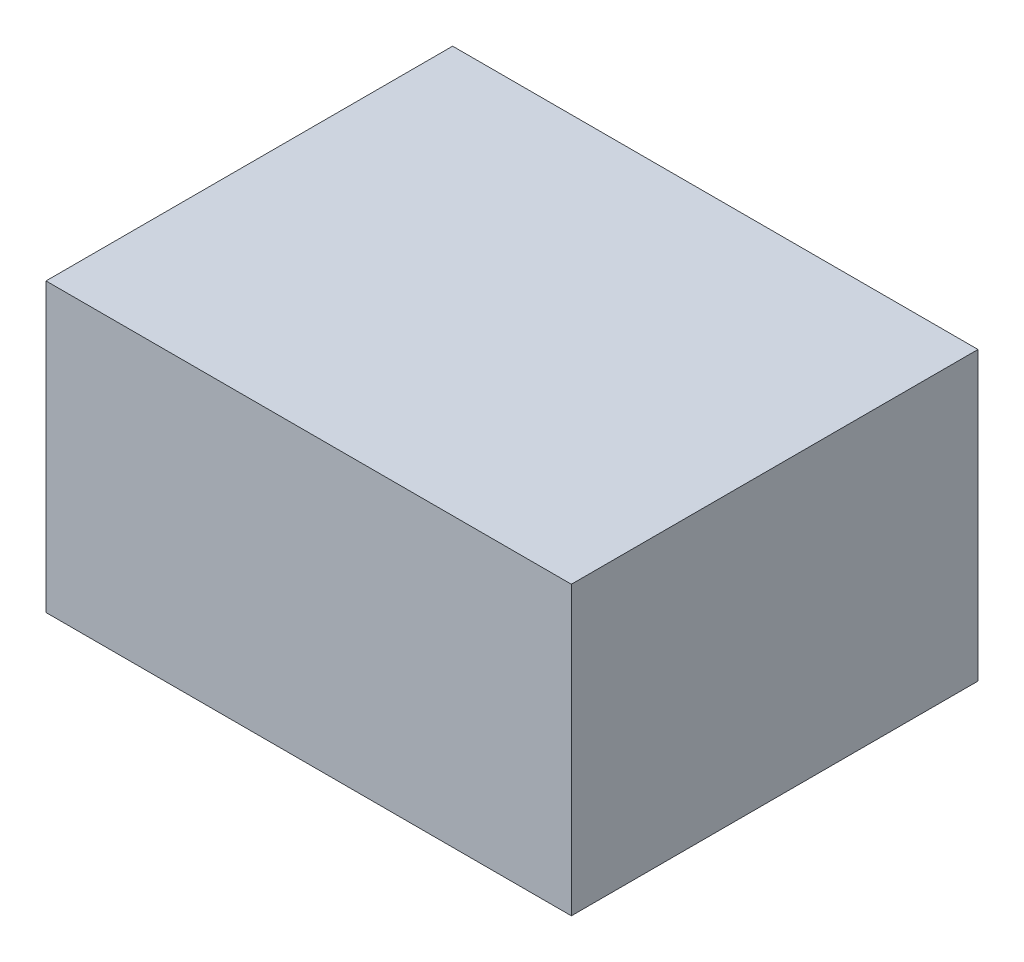
ISO-10303-21;
HEADER;
FILE_DESCRIPTION(('STEP AP214'),'2;1');
FILE_NAME('part.step','',(''),(''),'','','');
FILE_SCHEMA(('AUTOMOTIVE_DESIGN { 1 0 10303 214 1 1 1 1 }'));
ENDSEC;
DATA;
#1=APPLICATION_CONTEXT('core data for automotive mechanical design processes');
#2=APPLICATION_PROTOCOL_DEFINITION('international standard','automotive_design',2000,#1);
#3=PRODUCT_CONTEXT('',#1,'mechanical');
#4=PRODUCT('Part','Part','',(#3));
#5=PRODUCT_RELATED_PRODUCT_CATEGORY('part','',(#4));
#6=PRODUCT_DEFINITION_FORMATION('','',#4);
#7=PRODUCT_DEFINITION_CONTEXT('part definition',#1,'design');
#8=PRODUCT_DEFINITION('design','',#6,#7);
#9=PRODUCT_DEFINITION_SHAPE('','',#8);
#10=(LENGTH_UNIT() NAMED_UNIT(*) SI_UNIT(.MILLI.,.METRE.));
#11=(NAMED_UNIT(*) PLANE_ANGLE_UNIT() SI_UNIT($,.RADIAN.));
#12=(NAMED_UNIT(*) SI_UNIT($,.STERADIAN.) SOLID_ANGLE_UNIT());
#13=UNCERTAINTY_MEASURE_WITH_UNIT(LENGTH_MEASURE(1.E-05),#10,'distance_accuracy_value','');
#14=(GEOMETRIC_REPRESENTATION_CONTEXT(3) GLOBAL_UNCERTAINTY_ASSIGNED_CONTEXT((#13)) GLOBAL_UNIT_ASSIGNED_CONTEXT((#10,
#11,#12)) REPRESENTATION_CONTEXT('',''));
#15=CARTESIAN_POINT('',(0.,0.,0.));
#16=DIRECTION('',(0.,0.,1.));
#17=DIRECTION('',(1.,0.,0.));
#18=AXIS2_PLACEMENT_3D('',#15,#16,#17);
#19=CARTESIAN_POINT('',(-12.5,12.36,0.));
#20=DIRECTION('',(1.,0.,0.));
#21=DIRECTION('',(0.,0.,-1.));
#22=AXIS2_PLACEMENT_3D('',#19,#20,#21);
#23=PLANE('',#22);
#24=DIRECTION('',(0.,-1.,0.));
#25=VECTOR('',#24,1.);
#26=CARTESIAN_POINT('',(-12.5,12.36,-35.));
#27=LINE('',#26,#25);
#28=CARTESIAN_POINT('',(-12.5,12.36,-35.));
#29=VERTEX_POINT('',#28);
#30=CARTESIAN_POINT('',(-12.5,-12.36,-35.));
#31=VERTEX_POINT('',#30);
#32=EDGE_CURVE('E105',#29,#31,#27,.T.);
#33=ORIENTED_EDGE('',*,*,#32,.T.);
#34=DIRECTION('',(0.,0.,-1.));
#35=VECTOR('',#34,1.);
#36=CARTESIAN_POINT('',(-12.5,-12.36,0.));
#37=LINE('',#36,#35);
#38=CARTESIAN_POINT('',(-12.5,-12.36,0.));
#39=VERTEX_POINT('',#38);
#40=EDGE_CURVE('E11',#39,#31,#37,.T.);
#41=ORIENTED_EDGE('',*,*,#40,.F.);
#42=DIRECTION('',(0.,-1.,0.));
#43=VECTOR('',#42,1.);
#44=CARTESIAN_POINT('',(-12.5,12.36,0.));
#45=LINE('',#44,#43);
#46=CARTESIAN_POINT('',(-12.5,12.36,0.));
#47=VERTEX_POINT('',#46);
#48=EDGE_CURVE('E89',#47,#39,#45,.T.);
#49=ORIENTED_EDGE('',*,*,#48,.F.);
#50=DIRECTION('',(0.,0.,-1.));
#51=VECTOR('',#50,1.);
#52=CARTESIAN_POINT('',(-12.5,12.36,0.));
#53=LINE('',#52,#51);
#54=EDGE_CURVE('E97',#47,#29,#53,.T.);
#55=ORIENTED_EDGE('',*,*,#54,.T.);
#56=EDGE_LOOP('',(#33,#41,#49,#55));
#57=FACE_BOUND('',#56,.T.);
#58=ADVANCED_FACE('F39',(#57),#23,.F.);
#59=CARTESIAN_POINT('',(-12.5,-12.36,0.));
#60=DIRECTION('',(0.,1.,0.));
#61=DIRECTION('',(0.,0.,1.));
#62=AXIS2_PLACEMENT_3D('',#59,#60,#61);
#63=PLANE('',#62);
#64=DIRECTION('',(1.,0.,0.));
#65=VECTOR('',#64,1.);
#66=CARTESIAN_POINT('',(-12.5,-12.36,-35.));
#67=LINE('',#66,#65);
#68=CARTESIAN_POINT('',(32.72,-12.36,-35.));
#69=VERTEX_POINT('',#68);
#70=EDGE_CURVE('E92',#31,#69,#67,.T.);
#71=ORIENTED_EDGE('',*,*,#70,.T.);
#72=DIRECTION('',(0.,0.,-1.));
#73=VECTOR('',#72,1.);
#74=CARTESIAN_POINT('',(32.72,-12.36,0.));
#75=LINE('',#74,#73);
#76=CARTESIAN_POINT('',(32.72,-12.36,0.));
#77=VERTEX_POINT('',#76);
#78=EDGE_CURVE('E50',#77,#69,#75,.T.);
#79=ORIENTED_EDGE('',*,*,#78,.F.);
#80=DIRECTION('',(1.,0.,0.));
#81=VECTOR('',#80,1.);
#82=CARTESIAN_POINT('',(-12.5,-12.36,0.));
#83=LINE('',#82,#81);
#84=EDGE_CURVE('E82',#39,#77,#83,.T.);
#85=ORIENTED_EDGE('',*,*,#84,.F.);
#86=ORIENTED_EDGE('',*,*,#40,.T.);
#87=EDGE_LOOP('',(#71,#79,#85,#86));
#88=FACE_BOUND('',#87,.T.);
#89=ADVANCED_FACE('F93',(#88),#63,.F.);
#90=CARTESIAN_POINT('',(32.72,-12.36,0.));
#91=DIRECTION('',(-1.,0.,0.));
#92=DIRECTION('',(0.,0.,1.));
#93=AXIS2_PLACEMENT_3D('',#90,#91,#92);
#94=PLANE('',#93);
#95=DIRECTION('',(0.,1.,0.));
#96=VECTOR('',#95,1.);
#97=CARTESIAN_POINT('',(32.72,-12.36,-35.));
#98=LINE('',#97,#96);
#99=CARTESIAN_POINT('',(32.72,12.36,-35.));
#100=VERTEX_POINT('',#99);
#101=EDGE_CURVE('E74',#69,#100,#98,.T.);
#102=ORIENTED_EDGE('',*,*,#101,.T.);
#103=DIRECTION('',(0.,0.,-1.));
#104=VECTOR('',#103,1.);
#105=CARTESIAN_POINT('',(32.72,12.36,0.));
#106=LINE('',#105,#104);
#107=CARTESIAN_POINT('',(32.72,12.36,0.));
#108=VERTEX_POINT('',#107);
#109=EDGE_CURVE('E94',#108,#100,#106,.T.);
#110=ORIENTED_EDGE('',*,*,#109,.F.);
#111=DIRECTION('',(0.,1.,0.));
#112=VECTOR('',#111,1.);
#113=CARTESIAN_POINT('',(32.72,-12.36,0.));
#114=LINE('',#113,#112);
#115=EDGE_CURVE('E88',#77,#108,#114,.T.);
#116=ORIENTED_EDGE('',*,*,#115,.F.);
#117=ORIENTED_EDGE('',*,*,#78,.T.);
#118=EDGE_LOOP('',(#102,#110,#116,#117));
#119=FACE_BOUND('',#118,.T.);
#120=ADVANCED_FACE('F96',(#119),#94,.F.);
#121=CARTESIAN_POINT('',(32.72,12.36,0.));
#122=DIRECTION('',(0.,-1.,0.));
#123=DIRECTION('',(0.,0.,-1.));
#124=AXIS2_PLACEMENT_3D('',#121,#122,#123);
#125=PLANE('',#124);
#126=DIRECTION('',(-1.,0.,0.));
#127=VECTOR('',#126,1.);
#128=CARTESIAN_POINT('',(32.72,12.36,-35.));
#129=LINE('',#128,#127);
#130=EDGE_CURVE('E76',#100,#29,#129,.T.);
#131=ORIENTED_EDGE('',*,*,#130,.T.);
#132=ORIENTED_EDGE('',*,*,#54,.F.);
#133=DIRECTION('',(-1.,0.,0.));
#134=VECTOR('',#133,1.);
#135=CARTESIAN_POINT('',(32.72,12.36,0.));
#136=LINE('',#135,#134);
#137=EDGE_CURVE('E54',#108,#47,#136,.T.);
#138=ORIENTED_EDGE('',*,*,#137,.F.);
#139=ORIENTED_EDGE('',*,*,#109,.T.);
#140=EDGE_LOOP('',(#131,#132,#138,#139));
#141=FACE_BOUND('',#140,.T.);
#142=ADVANCED_FACE('F106',(#141),#125,.F.);
#143=CARTESIAN_POINT('',(0.,0.,0.));
#144=DIRECTION('',(0.,0.,1.));
#145=DIRECTION('',(1.,0.,0.));
#146=AXIS2_PLACEMENT_3D('',#143,#144,#145);
#147=PLANE('',#146);
#148=ORIENTED_EDGE('',*,*,#48,.T.);
#149=ORIENTED_EDGE('',*,*,#84,.T.);
#150=ORIENTED_EDGE('',*,*,#115,.T.);
#151=ORIENTED_EDGE('',*,*,#137,.T.);
#152=EDGE_LOOP('',(#148,#149,#150,#151));
#153=FACE_BOUND('',#152,.T.);
#154=ADVANCED_FACE('F86',(#153),#147,.T.);
#155=CARTESIAN_POINT('',(0.,0.,-35.));
#156=DIRECTION('',(0.,0.,1.));
#157=DIRECTION('',(1.,0.,0.));
#158=AXIS2_PLACEMENT_3D('',#155,#156,#157);
#159=PLANE('',#158);
#160=ORIENTED_EDGE('',*,*,#32,.F.);
#161=ORIENTED_EDGE('',*,*,#130,.F.);
#162=ORIENTED_EDGE('',*,*,#101,.F.);
#163=ORIENTED_EDGE('',*,*,#70,.F.);
#164=EDGE_LOOP('',(#160,#161,#162,#163));
#165=FACE_BOUND('',#164,.T.);
#166=ADVANCED_FACE('F115',(#165),#159,.F.);
#167=CLOSED_SHELL('',(#58,#89,#120,#142,#154,#166));
#168=MANIFOLD_SOLID_BREP('B2',#167);
#169=ADVANCED_BREP_SHAPE_REPRESENTATION('',(#18,#168),#14);
#170=SHAPE_DEFINITION_REPRESENTATION(#9,#169);
ENDSEC;
END-ISO-10303-21;
